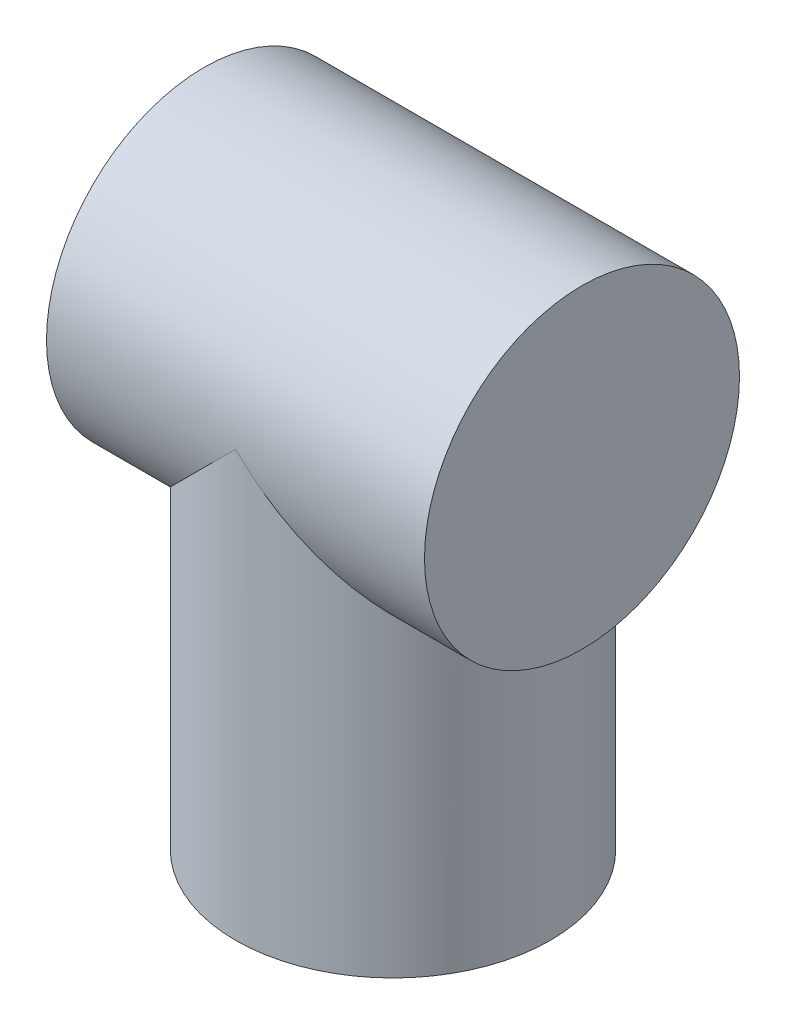
ISO-10303-21;
HEADER;
FILE_DESCRIPTION(('STEP AP214'),'2;1');
FILE_NAME('part.step','',(''),(''),'','','');
FILE_SCHEMA(('AUTOMOTIVE_DESIGN { 1 0 10303 214 1 1 1 1 }'));
ENDSEC;
DATA;
#1=APPLICATION_CONTEXT('core data for automotive mechanical design processes');
#2=APPLICATION_PROTOCOL_DEFINITION('international standard','automotive_design',2000,#1);
#3=PRODUCT_CONTEXT('',#1,'mechanical');
#4=PRODUCT('Part','Part','',(#3));
#5=PRODUCT_RELATED_PRODUCT_CATEGORY('part','',(#4));
#6=PRODUCT_DEFINITION_FORMATION('','',#4);
#7=PRODUCT_DEFINITION_CONTEXT('part definition',#1,'design');
#8=PRODUCT_DEFINITION('design','',#6,#7);
#9=PRODUCT_DEFINITION_SHAPE('','',#8);
#10=(LENGTH_UNIT() NAMED_UNIT(*) SI_UNIT(.MILLI.,.METRE.));
#11=(NAMED_UNIT(*) PLANE_ANGLE_UNIT() SI_UNIT($,.RADIAN.));
#12=(NAMED_UNIT(*) SI_UNIT($,.STERADIAN.) SOLID_ANGLE_UNIT());
#13=UNCERTAINTY_MEASURE_WITH_UNIT(LENGTH_MEASURE(1.E-05),#10,'distance_accuracy_value','');
#14=(GEOMETRIC_REPRESENTATION_CONTEXT(3) GLOBAL_UNCERTAINTY_ASSIGNED_CONTEXT((#13)) GLOBAL_UNIT_ASSIGNED_CONTEXT((#10,
#11,#12)) REPRESENTATION_CONTEXT('',''));
#15=CARTESIAN_POINT('',(0.,0.,0.));
#16=DIRECTION('',(0.,0.,1.));
#17=DIRECTION('',(1.,0.,0.));
#18=AXIS2_PLACEMENT_3D('',#15,#16,#17);
#19=CARTESIAN_POINT('',(0.,135.,0.));
#20=DIRECTION('',(0.,-1.,0.));
#21=DIRECTION('',(0.,0.,-1.));
#22=AXIS2_PLACEMENT_3D('',#19,#20,#21);
#23=CYLINDRICAL_SURFACE('',#22,50.);
#24=CARTESIAN_POINT('',(0.,0.,0.));
#25=DIRECTION('',(0.,1.,0.));
#26=DIRECTION('',(0.,0.,1.));
#27=AXIS2_PLACEMENT_3D('',#24,#25,#26);
#28=CIRCLE('',#27,50.);
#29=CARTESIAN_POINT('',(0.,0.,50.));
#30=VERTEX_POINT('',#29);
#31=EDGE_CURVE('E11',#30,#30,#28,.T.);
#32=ORIENTED_EDGE('',*,*,#31,.T.);
#33=EDGE_LOOP('',(#32));
#34=FACE_BOUND('',#33,.T.);
#35=CARTESIAN_POINT('',(0.,135.,0.));
#36=DIRECTION('',(-0.707106781186547,-0.707106781186547,0.));
#37=DIRECTION('',(0.707106781186547,-0.707106781186547,0.));
#38=AXIS2_PLACEMENT_3D('',#35,#36,#37);
#39=ELLIPSE('',#38,70.7106781186548,50.);
#40=CARTESIAN_POINT('',(0.,135.,50.));
#41=VERTEX_POINT('',#40);
#42=CARTESIAN_POINT('',(0.,135.,-50.));
#43=VERTEX_POINT('',#42);
#44=EDGE_CURVE('E47',#41,#43,#39,.F.);
#45=ORIENTED_EDGE('',*,*,#44,.F.);
#46=CARTESIAN_POINT('',(0.,135.,0.));
#47=DIRECTION('',(0.707106781186547,-0.707106781186547,0.));
#48=DIRECTION('',(-0.707106781186547,-0.707106781186547,0.));
#49=AXIS2_PLACEMENT_3D('',#46,#47,#48);
#50=ELLIPSE('',#49,70.7106781186548,50.);
#51=EDGE_CURVE('E53',#43,#41,#50,.F.);
#52=ORIENTED_EDGE('',*,*,#51,.F.);
#53=EDGE_LOOP('',(#45,#52));
#54=FACE_BOUND('',#53,.T.);
#55=ADVANCED_FACE('F39',(#34,#54),#23,.T.);
#56=CARTESIAN_POINT('',(0.,0.,0.));
#57=DIRECTION('',(0.,1.,0.));
#58=DIRECTION('',(0.,0.,1.));
#59=AXIS2_PLACEMENT_3D('',#56,#57,#58);
#60=PLANE('',#59);
#61=ORIENTED_EDGE('',*,*,#31,.F.);
#62=EDGE_LOOP('',(#61));
#63=FACE_BOUND('',#62,.T.);
#64=ADVANCED_FACE('F82',(#63),#60,.F.);
#65=CARTESIAN_POINT('',(60.,135.,0.));
#66=DIRECTION('',(-1.,0.,0.));
#67=DIRECTION('',(0.,0.,1.));
#68=AXIS2_PLACEMENT_3D('',#65,#66,#67);
#69=CYLINDRICAL_SURFACE('',#68,50.);
#70=CARTESIAN_POINT('',(60.,135.,0.));
#71=DIRECTION('',(1.,0.,0.));
#72=DIRECTION('',(0.,0.,-1.));
#73=AXIS2_PLACEMENT_3D('',#70,#71,#72);
#74=CIRCLE('',#73,50.);
#75=CARTESIAN_POINT('',(60.,135.,-50.));
#76=VERTEX_POINT('',#75);
#77=EDGE_CURVE('E59',#76,#76,#74,.T.);
#78=ORIENTED_EDGE('',*,*,#77,.F.);
#79=EDGE_LOOP('',(#78));
#80=FACE_BOUND('',#79,.T.);
#81=CARTESIAN_POINT('',(-60.,135.,0.));
#82=DIRECTION('',(1.,0.,0.));
#83=DIRECTION('',(0.,0.,-1.));
#84=AXIS2_PLACEMENT_3D('',#81,#82,#83);
#85=CIRCLE('',#84,50.);
#86=CARTESIAN_POINT('',(-60.,135.,-50.));
#87=VERTEX_POINT('',#86);
#88=EDGE_CURVE('E63',#87,#87,#85,.T.);
#89=ORIENTED_EDGE('',*,*,#88,.T.);
#90=EDGE_LOOP('',(#89));
#91=FACE_BOUND('',#90,.T.);
#92=ORIENTED_EDGE('',*,*,#51,.T.);
#93=ORIENTED_EDGE('',*,*,#44,.T.);
#94=EDGE_LOOP('',(#92,#93));
#95=FACE_BOUND('',#94,.T.);
#96=ADVANCED_FACE('F57',(#80,#91,#95),#69,.T.);
#97=CARTESIAN_POINT('',(60.,135.,0.));
#98=DIRECTION('',(1.,0.,0.));
#99=DIRECTION('',(0.,0.,-1.));
#100=AXIS2_PLACEMENT_3D('',#97,#98,#99);
#101=PLANE('',#100);
#102=ORIENTED_EDGE('',*,*,#77,.T.);
#103=EDGE_LOOP('',(#102));
#104=FACE_BOUND('',#103,.T.);
#105=ADVANCED_FACE('F73',(#104),#101,.T.);
#106=CARTESIAN_POINT('',(-60.,135.,0.));
#107=DIRECTION('',(1.,0.,0.));
#108=DIRECTION('',(0.,0.,-1.));
#109=AXIS2_PLACEMENT_3D('',#106,#107,#108);
#110=PLANE('',#109);
#111=ORIENTED_EDGE('',*,*,#88,.F.);
#112=EDGE_LOOP('',(#111));
#113=FACE_BOUND('',#112,.T.);
#114=ADVANCED_FACE('F71',(#113),#110,.F.);
#115=CLOSED_SHELL('',(#55,#64,#96,#105,#114));
#116=MANIFOLD_SOLID_BREP('B2',#115);
#117=ADVANCED_BREP_SHAPE_REPRESENTATION('',(#18,#116),#14);
#118=SHAPE_DEFINITION_REPRESENTATION(#9,#117);
ENDSEC;
END-ISO-10303-21;
